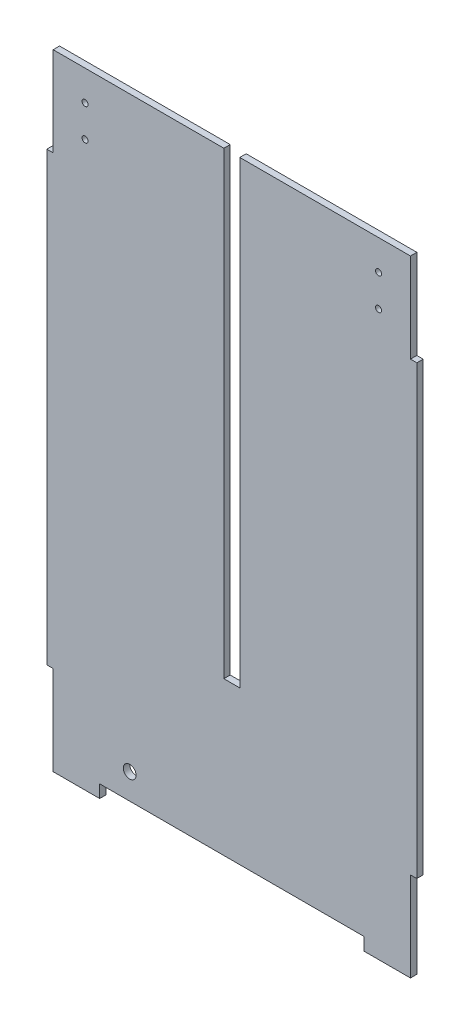
ISO-10303-21;
HEADER;
FILE_DESCRIPTION(('STEP AP214'),'2;1');
FILE_NAME('part.step','',(''),(''),'','','');
FILE_SCHEMA(('AUTOMOTIVE_DESIGN { 1 0 10303 214 1 1 1 1 }'));
ENDSEC;
DATA;
#1=APPLICATION_CONTEXT('core data for automotive mechanical design processes');
#2=APPLICATION_PROTOCOL_DEFINITION('international standard','automotive_design',2000,#1);
#3=PRODUCT_CONTEXT('',#1,'mechanical');
#4=PRODUCT('Part','Part','',(#3));
#5=PRODUCT_RELATED_PRODUCT_CATEGORY('part','',(#4));
#6=PRODUCT_DEFINITION_FORMATION('','',#4);
#7=PRODUCT_DEFINITION_CONTEXT('part definition',#1,'design');
#8=PRODUCT_DEFINITION('design','',#6,#7);
#9=PRODUCT_DEFINITION_SHAPE('','',#8);
#10=(LENGTH_UNIT() NAMED_UNIT(*) SI_UNIT(.MILLI.,.METRE.));
#11=(NAMED_UNIT(*) PLANE_ANGLE_UNIT() SI_UNIT($,.RADIAN.));
#12=(NAMED_UNIT(*) SI_UNIT($,.STERADIAN.) SOLID_ANGLE_UNIT());
#13=UNCERTAINTY_MEASURE_WITH_UNIT(LENGTH_MEASURE(1.E-05),#10,'distance_accuracy_value','');
#14=(GEOMETRIC_REPRESENTATION_CONTEXT(3) GLOBAL_UNCERTAINTY_ASSIGNED_CONTEXT((#13)) GLOBAL_UNIT_ASSIGNED_CONTEXT((#10,
#11,#12)) REPRESENTATION_CONTEXT('',''));
#15=CARTESIAN_POINT('',(0.,0.,0.));
#16=DIRECTION('',(0.,0.,1.));
#17=DIRECTION('',(1.,0.,0.));
#18=AXIS2_PLACEMENT_3D('',#15,#16,#17);
#19=CARTESIAN_POINT('',(0.,152.4,3.175));
#20=DIRECTION('',(0.,1.,0.));
#21=DIRECTION('',(0.,0.,1.));
#22=AXIS2_PLACEMENT_3D('',#19,#20,#21);
#23=PLANE('',#22);
#24=DIRECTION('',(0.,0.,1.));
#25=VECTOR('',#24,1.);
#26=CARTESIAN_POINT('',(-3.96875000000001,152.4,0.));
#27=LINE('',#26,#25);
#28=CARTESIAN_POINT('',(-3.96875000000001,152.4,0.));
#29=VERTEX_POINT('',#28);
#30=CARTESIAN_POINT('',(-3.96875000000001,152.4,3.175));
#31=VERTEX_POINT('',#30);
#32=EDGE_CURVE('E197',#29,#31,#27,.T.);
#33=ORIENTED_EDGE('',*,*,#32,.F.);
#34=DIRECTION('',(1.,0.,0.));
#35=VECTOR('',#34,1.);
#36=CARTESIAN_POINT('',(0.,152.4,0.));
#37=LINE('',#36,#35);
#38=CARTESIAN_POINT('',(-88.9,152.4,0.));
#39=VERTEX_POINT('',#38);
#40=EDGE_CURVE('E212',#39,#29,#37,.T.);
#41=ORIENTED_EDGE('',*,*,#40,.F.);
#42=DIRECTION('',(0.,0.,-1.));
#43=VECTOR('',#42,1.);
#44=CARTESIAN_POINT('',(-88.9,152.4,3.175));
#45=LINE('',#44,#43);
#46=CARTESIAN_POINT('',(-88.9,152.4,3.175));
#47=VERTEX_POINT('',#46);
#48=EDGE_CURVE('E243',#47,#39,#45,.T.);
#49=ORIENTED_EDGE('',*,*,#48,.F.);
#50=DIRECTION('',(1.,0.,0.));
#51=VECTOR('',#50,1.);
#52=CARTESIAN_POINT('',(0.,152.4,3.175));
#53=LINE('',#52,#51);
#54=EDGE_CURVE('E294',#47,#31,#53,.T.);
#55=ORIENTED_EDGE('',*,*,#54,.T.);
#56=EDGE_LOOP('',(#33,#41,#49,#55));
#57=FACE_BOUND('',#56,.T.);
#58=ADVANCED_FACE('F36',(#57),#23,.T.);
#59=CARTESIAN_POINT('',(65.7678571428565,2.87468461733298E-13,3.175));
#60=DIRECTION('',(1.,0.,0.));
#61=DIRECTION('',(0.,1.,0.));
#62=AXIS2_PLACEMENT_3D('',#59,#60,#61);
#63=PLANE('',#62);
#64=DIRECTION('',(0.,-1.,0.));
#65=VECTOR('',#64,1.);
#66=CARTESIAN_POINT('',(65.7678571428565,2.87468461733298E-13,0.));
#67=LINE('',#66,#65);
#68=CARTESIAN_POINT('',(65.7678571428572,-152.4,0.));
#69=VERTEX_POINT('',#68);
#70=CARTESIAN_POINT('',(65.7678571428572,-158.75,0.));
#71=VERTEX_POINT('',#70);
#72=EDGE_CURVE('E193',#69,#71,#67,.T.);
#73=ORIENTED_EDGE('',*,*,#72,.T.);
#74=DIRECTION('',(0.,0.,-1.));
#75=VECTOR('',#74,1.);
#76=CARTESIAN_POINT('',(65.7678571428572,-158.75,3.175));
#77=LINE('',#76,#75);
#78=CARTESIAN_POINT('',(65.7678571428572,-158.75,3.175));
#79=VERTEX_POINT('',#78);
#80=EDGE_CURVE('E44',#79,#71,#77,.T.);
#81=ORIENTED_EDGE('',*,*,#80,.F.);
#82=DIRECTION('',(0.,-1.,0.));
#83=VECTOR('',#82,1.);
#84=CARTESIAN_POINT('',(65.7678571428565,2.87468461733298E-13,3.175));
#85=LINE('',#84,#83);
#86=CARTESIAN_POINT('',(65.7678571428572,-152.4,3.175));
#87=VERTEX_POINT('',#86);
#88=EDGE_CURVE('E279',#87,#79,#85,.T.);
#89=ORIENTED_EDGE('',*,*,#88,.F.);
#90=DIRECTION('',(0.,0.,-1.));
#91=VECTOR('',#90,1.);
#92=CARTESIAN_POINT('',(65.7678571428572,-152.4,3.175));
#93=LINE('',#92,#91);
#94=EDGE_CURVE('E11',#87,#69,#93,.T.);
#95=ORIENTED_EDGE('',*,*,#94,.T.);
#96=EDGE_LOOP('',(#73,#81,#89,#95));
#97=FACE_BOUND('',#96,.T.);
#98=ADVANCED_FACE('F38',(#97),#63,.F.);
#99=CARTESIAN_POINT('',(0.,-158.75,3.175));
#100=DIRECTION('',(0.,-1.,0.));
#101=DIRECTION('',(0.,0.,-1.));
#102=AXIS2_PLACEMENT_3D('',#99,#100,#101);
#103=PLANE('',#102);
#104=DIRECTION('',(-1.,0.,0.));
#105=VECTOR('',#104,1.);
#106=CARTESIAN_POINT('',(0.,-158.75,0.));
#107=LINE('',#106,#105);
#108=CARTESIAN_POINT('',(88.9000000000028,-158.75,0.));
#109=VERTEX_POINT('',#108);
#110=EDGE_CURVE('E196',#109,#71,#107,.T.);
#111=ORIENTED_EDGE('',*,*,#110,.F.);
#112=DIRECTION('',(0.,0.,-1.));
#113=VECTOR('',#112,1.);
#114=CARTESIAN_POINT('',(88.9000000000028,-158.75,3.175));
#115=LINE('',#114,#113);
#116=CARTESIAN_POINT('',(88.9000000000028,-158.75,3.175));
#117=VERTEX_POINT('',#116);
#118=EDGE_CURVE('E257',#117,#109,#115,.T.);
#119=ORIENTED_EDGE('',*,*,#118,.F.);
#120=DIRECTION('',(-1.,0.,0.));
#121=VECTOR('',#120,1.);
#122=CARTESIAN_POINT('',(0.,-158.75,3.175));
#123=LINE('',#122,#121);
#124=EDGE_CURVE('E264',#117,#79,#123,.T.);
#125=ORIENTED_EDGE('',*,*,#124,.T.);
#126=ORIENTED_EDGE('',*,*,#80,.T.);
#127=EDGE_LOOP('',(#111,#119,#125,#126));
#128=FACE_BOUND('',#127,.T.);
#129=ADVANCED_FACE('F262',(#128),#103,.T.);
#130=CARTESIAN_POINT('',(88.9,0.,3.175));
#131=DIRECTION('',(1.,0.,0.));
#132=DIRECTION('',(0.,0.,-1.));
#133=AXIS2_PLACEMENT_3D('',#130,#131,#132);
#134=PLANE('',#133);
#135=DIRECTION('',(0.,-1.,0.));
#136=VECTOR('',#135,1.);
#137=CARTESIAN_POINT('',(88.9,0.,0.));
#138=LINE('',#137,#136);
#139=CARTESIAN_POINT('',(88.9,-114.3,0.));
#140=VERTEX_POINT('',#139);
#141=EDGE_CURVE('E200',#140,#109,#138,.T.);
#142=ORIENTED_EDGE('',*,*,#141,.F.);
#143=DIRECTION('',(0.,0.,-1.));
#144=VECTOR('',#143,1.);
#145=CARTESIAN_POINT('',(88.9,-114.3,3.175));
#146=LINE('',#145,#144);
#147=CARTESIAN_POINT('',(88.9,-114.3,3.175));
#148=VERTEX_POINT('',#147);
#149=EDGE_CURVE('E255',#148,#140,#146,.T.);
#150=ORIENTED_EDGE('',*,*,#149,.F.);
#151=DIRECTION('',(0.,-1.,0.));
#152=VECTOR('',#151,1.);
#153=CARTESIAN_POINT('',(88.9,0.,3.175));
#154=LINE('',#153,#152);
#155=EDGE_CURVE('E278',#148,#117,#154,.T.);
#156=ORIENTED_EDGE('',*,*,#155,.T.);
#157=ORIENTED_EDGE('',*,*,#118,.T.);
#158=EDGE_LOOP('',(#142,#150,#156,#157));
#159=FACE_BOUND('',#158,.T.);
#160=ADVANCED_FACE('F274',(#159),#134,.T.);
#161=CARTESIAN_POINT('',(0.,-114.3,3.175));
#162=DIRECTION('',(0.,1.,0.));
#163=DIRECTION('',(0.,0.,1.));
#164=AXIS2_PLACEMENT_3D('',#161,#162,#163);
#165=PLANE('',#164);
#166=DIRECTION('',(1.,0.,0.));
#167=VECTOR('',#166,1.);
#168=CARTESIAN_POINT('',(0.,-114.3,0.));
#169=LINE('',#168,#167);
#170=CARTESIAN_POINT('',(92.0750000000023,-114.3,0.));
#171=VERTEX_POINT('',#170);
#172=EDGE_CURVE('E203',#140,#171,#169,.T.);
#173=ORIENTED_EDGE('',*,*,#172,.T.);
#174=DIRECTION('',(0.,0.,-1.));
#175=VECTOR('',#174,1.);
#176=CARTESIAN_POINT('',(92.0750000000023,-114.3,3.175));
#177=LINE('',#176,#175);
#178=CARTESIAN_POINT('',(92.0750000000023,-114.3,3.175));
#179=VERTEX_POINT('',#178);
#180=EDGE_CURVE('E252',#179,#171,#177,.T.);
#181=ORIENTED_EDGE('',*,*,#180,.F.);
#182=DIRECTION('',(1.,0.,0.));
#183=VECTOR('',#182,1.);
#184=CARTESIAN_POINT('',(0.,-114.3,3.175));
#185=LINE('',#184,#183);
#186=EDGE_CURVE('E281',#148,#179,#185,.T.);
#187=ORIENTED_EDGE('',*,*,#186,.F.);
#188=ORIENTED_EDGE('',*,*,#149,.T.);
#189=EDGE_LOOP('',(#173,#181,#187,#188));
#190=FACE_BOUND('',#189,.T.);
#191=ADVANCED_FACE('F530',(#190),#165,.F.);
#192=CARTESIAN_POINT('',(92.0750000000005,0.,3.175));
#193=DIRECTION('',(1.,0.,0.));
#194=DIRECTION('',(0.,0.,-1.));
#195=AXIS2_PLACEMENT_3D('',#192,#193,#194);
#196=PLANE('',#195);
#197=DIRECTION('',(0.,-1.,0.));
#198=VECTOR('',#197,1.);
#199=CARTESIAN_POINT('',(92.0750000000005,0.,0.));
#200=LINE('',#199,#198);
#201=CARTESIAN_POINT('',(92.075,107.95,0.));
#202=VERTEX_POINT('',#201);
#203=EDGE_CURVE('E207',#202,#171,#200,.T.);
#204=ORIENTED_EDGE('',*,*,#203,.F.);
#205=DIRECTION('',(0.,0.,-1.));
#206=VECTOR('',#205,1.);
#207=CARTESIAN_POINT('',(92.075,107.95,3.175));
#208=LINE('',#207,#206);
#209=CARTESIAN_POINT('',(92.075,107.95,3.175));
#210=VERTEX_POINT('',#209);
#211=EDGE_CURVE('E250',#210,#202,#208,.T.);
#212=ORIENTED_EDGE('',*,*,#211,.F.);
#213=DIRECTION('',(0.,-1.,0.));
#214=VECTOR('',#213,1.);
#215=CARTESIAN_POINT('',(92.0750000000023,0.,3.175));
#216=LINE('',#215,#214);
#217=EDGE_CURVE('E288',#210,#179,#216,.T.);
#218=ORIENTED_EDGE('',*,*,#217,.T.);
#219=ORIENTED_EDGE('',*,*,#180,.T.);
#220=EDGE_LOOP('',(#204,#212,#218,#219));
#221=FACE_BOUND('',#220,.T.);
#222=ADVANCED_FACE('F526',(#221),#196,.T.);
#223=CARTESIAN_POINT('',(0.,107.95,3.175));
#224=DIRECTION('',(0.,1.,0.));
#225=DIRECTION('',(0.,0.,1.));
#226=AXIS2_PLACEMENT_3D('',#223,#224,#225);
#227=PLANE('',#226);
#228=DIRECTION('',(1.,0.,0.));
#229=VECTOR('',#228,1.);
#230=CARTESIAN_POINT('',(0.,107.95,0.));
#231=LINE('',#230,#229);
#232=CARTESIAN_POINT('',(88.9,107.95,0.));
#233=VERTEX_POINT('',#232);
#234=EDGE_CURVE('E209',#233,#202,#231,.T.);
#235=ORIENTED_EDGE('',*,*,#234,.F.);
#236=DIRECTION('',(0.,0.,-1.));
#237=VECTOR('',#236,1.);
#238=CARTESIAN_POINT('',(88.9,107.95,3.175));
#239=LINE('',#238,#237);
#240=CARTESIAN_POINT('',(88.9,107.95,3.175));
#241=VERTEX_POINT('',#240);
#242=EDGE_CURVE('E248',#241,#233,#239,.T.);
#243=ORIENTED_EDGE('',*,*,#242,.F.);
#244=DIRECTION('',(1.,0.,0.));
#245=VECTOR('',#244,1.);
#246=CARTESIAN_POINT('',(0.,107.95,3.175));
#247=LINE('',#246,#245);
#248=EDGE_CURVE('E291',#241,#210,#247,.T.);
#249=ORIENTED_EDGE('',*,*,#248,.T.);
#250=ORIENTED_EDGE('',*,*,#211,.T.);
#251=EDGE_LOOP('',(#235,#243,#249,#250));
#252=FACE_BOUND('',#251,.T.);
#253=ADVANCED_FACE('F340',(#252),#227,.T.);
#254=CARTESIAN_POINT('',(88.9,152.4,0.));
#255=VERTEX_POINT('',#254);
#256=EDGE_CURVE('E204',#255,#233,#138,.T.);
#257=ORIENTED_EDGE('',*,*,#256,.F.);
#258=DIRECTION('',(0.,0.,-1.));
#259=VECTOR('',#258,1.);
#260=CARTESIAN_POINT('',(88.9,152.4,3.175));
#261=LINE('',#260,#259);
#262=CARTESIAN_POINT('',(88.9,152.4,3.175));
#263=VERTEX_POINT('',#262);
#264=EDGE_CURVE('E245',#263,#255,#261,.T.);
#265=ORIENTED_EDGE('',*,*,#264,.F.);
#266=EDGE_CURVE('E283',#263,#241,#154,.T.);
#267=ORIENTED_EDGE('',*,*,#266,.T.);
#268=ORIENTED_EDGE('',*,*,#242,.T.);
#269=EDGE_LOOP('',(#257,#265,#267,#268));
#270=FACE_BOUND('',#269,.T.);
#271=ADVANCED_FACE('F331',(#270),#134,.T.);
#272=DIRECTION('',(0.,0.,1.));
#273=VECTOR('',#272,1.);
#274=CARTESIAN_POINT('',(3.96874999999998,152.4,0.));
#275=LINE('',#274,#273);
#276=CARTESIAN_POINT('',(3.96874999999998,152.4,0.));
#277=VERTEX_POINT('',#276);
#278=CARTESIAN_POINT('',(3.96874999999998,152.4,3.175));
#279=VERTEX_POINT('',#278);
#280=EDGE_CURVE('E345',#277,#279,#275,.T.);
#281=ORIENTED_EDGE('',*,*,#280,.T.);
#282=EDGE_CURVE('E298',#279,#263,#53,.T.);
#283=ORIENTED_EDGE('',*,*,#282,.T.);
#284=ORIENTED_EDGE('',*,*,#264,.T.);
#285=EDGE_CURVE('E216',#277,#255,#37,.T.);
#286=ORIENTED_EDGE('',*,*,#285,.F.);
#287=EDGE_LOOP('',(#281,#283,#284,#286));
#288=FACE_BOUND('',#287,.T.);
#289=ADVANCED_FACE('F322',(#288),#23,.T.);
#290=CARTESIAN_POINT('',(-88.9,0.,3.175));
#291=DIRECTION('',(1.,0.,0.));
#292=DIRECTION('',(0.,0.,-1.));
#293=AXIS2_PLACEMENT_3D('',#290,#291,#292);
#294=PLANE('',#293);
#295=DIRECTION('',(0.,-1.,0.));
#296=VECTOR('',#295,1.);
#297=CARTESIAN_POINT('',(-88.9,0.,0.));
#298=LINE('',#297,#296);
#299=CARTESIAN_POINT('',(-88.9,107.95,0.));
#300=VERTEX_POINT('',#299);
#301=EDGE_CURVE('E215',#39,#300,#298,.T.);
#302=ORIENTED_EDGE('',*,*,#301,.T.);
#303=DIRECTION('',(0.,0.,-1.));
#304=VECTOR('',#303,1.);
#305=CARTESIAN_POINT('',(-88.9,107.95,3.175));
#306=LINE('',#305,#304);
#307=CARTESIAN_POINT('',(-88.9,107.95,3.175));
#308=VERTEX_POINT('',#307);
#309=EDGE_CURVE('E240',#308,#300,#306,.T.);
#310=ORIENTED_EDGE('',*,*,#309,.F.);
#311=DIRECTION('',(0.,-1.,0.));
#312=VECTOR('',#311,1.);
#313=CARTESIAN_POINT('',(-88.9,0.,3.175));
#314=LINE('',#313,#312);
#315=EDGE_CURVE('E297',#47,#308,#314,.T.);
#316=ORIENTED_EDGE('',*,*,#315,.F.);
#317=ORIENTED_EDGE('',*,*,#48,.T.);
#318=EDGE_LOOP('',(#302,#310,#316,#317));
#319=FACE_BOUND('',#318,.T.);
#320=ADVANCED_FACE('F330',(#319),#294,.F.);
#321=CARTESIAN_POINT('',(0.,107.95,3.175));
#322=DIRECTION('',(0.,-1.,0.));
#323=DIRECTION('',(0.,0.,-1.));
#324=AXIS2_PLACEMENT_3D('',#321,#322,#323);
#325=PLANE('',#324);
#326=DIRECTION('',(-1.,0.,0.));
#327=VECTOR('',#326,1.);
#328=CARTESIAN_POINT('',(0.,107.95,0.));
#329=LINE('',#328,#327);
#330=CARTESIAN_POINT('',(-92.075,107.95,0.));
#331=VERTEX_POINT('',#330);
#332=EDGE_CURVE('E218',#300,#331,#329,.T.);
#333=ORIENTED_EDGE('',*,*,#332,.T.);
#334=DIRECTION('',(0.,0.,-1.));
#335=VECTOR('',#334,1.);
#336=CARTESIAN_POINT('',(-92.075,107.95,3.175));
#337=LINE('',#336,#335);
#338=CARTESIAN_POINT('',(-92.075,107.95,3.175));
#339=VERTEX_POINT('',#338);
#340=EDGE_CURVE('E237',#339,#331,#337,.T.);
#341=ORIENTED_EDGE('',*,*,#340,.F.);
#342=DIRECTION('',(-1.,0.,0.));
#343=VECTOR('',#342,1.);
#344=CARTESIAN_POINT('',(0.,107.95,3.175));
#345=LINE('',#344,#343);
#346=EDGE_CURVE('E300',#308,#339,#345,.T.);
#347=ORIENTED_EDGE('',*,*,#346,.F.);
#348=ORIENTED_EDGE('',*,*,#309,.T.);
#349=EDGE_LOOP('',(#333,#341,#347,#348));
#350=FACE_BOUND('',#349,.T.);
#351=ADVANCED_FACE('F337',(#350),#325,.F.);
#352=CARTESIAN_POINT('',(-92.0749999999977,0.,3.175));
#353=DIRECTION('',(1.,0.,0.));
#354=DIRECTION('',(0.,0.,-1.));
#355=AXIS2_PLACEMENT_3D('',#352,#353,#354);
#356=PLANE('',#355);
#357=DIRECTION('',(0.,-1.,0.));
#358=VECTOR('',#357,1.);
#359=CARTESIAN_POINT('',(-92.0749999999977,0.,0.));
#360=LINE('',#359,#358);
#361=CARTESIAN_POINT('',(-92.0749999999977,-114.3,0.));
#362=VERTEX_POINT('',#361);
#363=EDGE_CURVE('E221',#331,#362,#360,.T.);
#364=ORIENTED_EDGE('',*,*,#363,.T.);
#365=DIRECTION('',(0.,0.,-1.));
#366=VECTOR('',#365,1.);
#367=CARTESIAN_POINT('',(-92.0749999999977,-114.3,3.175));
#368=LINE('',#367,#366);
#369=CARTESIAN_POINT('',(-92.0749999999977,-114.3,3.175));
#370=VERTEX_POINT('',#369);
#371=EDGE_CURVE('E235',#370,#362,#368,.T.);
#372=ORIENTED_EDGE('',*,*,#371,.F.);
#373=DIRECTION('',(0.,-1.,0.));
#374=VECTOR('',#373,1.);
#375=CARTESIAN_POINT('',(-92.0749999999989,-9.48645923719877E-13,3.175));
#376=LINE('',#375,#374);
#377=EDGE_CURVE('E302',#339,#370,#376,.T.);
#378=ORIENTED_EDGE('',*,*,#377,.F.);
#379=ORIENTED_EDGE('',*,*,#340,.T.);
#380=EDGE_LOOP('',(#364,#372,#378,#379));
#381=FACE_BOUND('',#380,.T.);
#382=ADVANCED_FACE('F410',(#381),#356,.F.);
#383=CARTESIAN_POINT('',(0.,-114.3,3.175));
#384=DIRECTION('',(0.,-1.,0.));
#385=DIRECTION('',(0.,0.,-1.));
#386=AXIS2_PLACEMENT_3D('',#383,#384,#385);
#387=PLANE('',#386);
#388=DIRECTION('',(-1.,0.,0.));
#389=VECTOR('',#388,1.);
#390=CARTESIAN_POINT('',(0.,-114.3,0.));
#391=LINE('',#390,#389);
#392=CARTESIAN_POINT('',(-88.9,-114.3,0.));
#393=VERTEX_POINT('',#392);
#394=EDGE_CURVE('E224',#393,#362,#391,.T.);
#395=ORIENTED_EDGE('',*,*,#394,.F.);
#396=DIRECTION('',(0.,0.,-1.));
#397=VECTOR('',#396,1.);
#398=CARTESIAN_POINT('',(-88.9,-114.3,3.175));
#399=LINE('',#398,#397);
#400=CARTESIAN_POINT('',(-88.9,-114.3,3.175));
#401=VERTEX_POINT('',#400);
#402=EDGE_CURVE('E181',#401,#393,#399,.T.);
#403=ORIENTED_EDGE('',*,*,#402,.F.);
#404=DIRECTION('',(-1.,0.,0.));
#405=VECTOR('',#404,1.);
#406=CARTESIAN_POINT('',(0.,-114.3,3.175));
#407=LINE('',#406,#405);
#408=EDGE_CURVE('E170',#401,#370,#407,.T.);
#409=ORIENTED_EDGE('',*,*,#408,.T.);
#410=ORIENTED_EDGE('',*,*,#371,.T.);
#411=EDGE_LOOP('',(#395,#403,#409,#410));
#412=FACE_BOUND('',#411,.T.);
#413=ADVANCED_FACE('F305',(#412),#387,.T.);
#414=CARTESIAN_POINT('',(-88.8999999999972,0.,3.175));
#415=DIRECTION('',(1.,0.,0.));
#416=DIRECTION('',(0.,0.,-1.));
#417=AXIS2_PLACEMENT_3D('',#414,#415,#416);
#418=PLANE('',#417);
#419=DIRECTION('',(0.,-1.,0.));
#420=VECTOR('',#419,1.);
#421=CARTESIAN_POINT('',(-88.8999999999972,0.,0.));
#422=LINE('',#421,#420);
#423=CARTESIAN_POINT('',(-88.8999999999972,-158.75,0.));
#424=VERTEX_POINT('',#423);
#425=EDGE_CURVE('E177',#393,#424,#422,.T.);
#426=ORIENTED_EDGE('',*,*,#425,.T.);
#427=DIRECTION('',(0.,0.,-1.));
#428=VECTOR('',#427,1.);
#429=CARTESIAN_POINT('',(-88.8999999999972,-158.75,3.175));
#430=LINE('',#429,#428);
#431=CARTESIAN_POINT('',(-88.8999999999972,-158.75,3.175));
#432=VERTEX_POINT('',#431);
#433=EDGE_CURVE('E174',#432,#424,#430,.T.);
#434=ORIENTED_EDGE('',*,*,#433,.F.);
#435=DIRECTION('',(0.,-1.,0.));
#436=VECTOR('',#435,1.);
#437=CARTESIAN_POINT('',(-88.8999999999972,0.,3.175));
#438=LINE('',#437,#436);
#439=EDGE_CURVE('E162',#401,#432,#438,.T.);
#440=ORIENTED_EDGE('',*,*,#439,.F.);
#441=ORIENTED_EDGE('',*,*,#402,.T.);
#442=EDGE_LOOP('',(#426,#434,#440,#441));
#443=FACE_BOUND('',#442,.T.);
#444=ADVANCED_FACE('F175',(#443),#418,.F.);
#445=CARTESIAN_POINT('',(0.,-158.75,3.175));
#446=DIRECTION('',(0.,-1.,0.));
#447=DIRECTION('',(0.,0.,-1.));
#448=AXIS2_PLACEMENT_3D('',#445,#446,#447);
#449=PLANE('',#448);
#450=DIRECTION('',(-1.,0.,0.));
#451=VECTOR('',#450,1.);
#452=CARTESIAN_POINT('',(0.,-158.75,0.));
#453=LINE('',#452,#451);
#454=CARTESIAN_POINT('',(-65.7678571428571,-158.75,0.));
#455=VERTEX_POINT('',#454);
#456=EDGE_CURVE('E228',#455,#424,#453,.T.);
#457=ORIENTED_EDGE('',*,*,#456,.F.);
#458=DIRECTION('',(0.,0.,-1.));
#459=VECTOR('',#458,1.);
#460=CARTESIAN_POINT('',(-65.7678571428571,-158.75,3.175));
#461=LINE('',#460,#459);
#462=CARTESIAN_POINT('',(-65.7678571428571,-158.75,3.175));
#463=VERTEX_POINT('',#462);
#464=EDGE_CURVE('E182',#463,#455,#461,.T.);
#465=ORIENTED_EDGE('',*,*,#464,.F.);
#466=DIRECTION('',(-1.,0.,0.));
#467=VECTOR('',#466,1.);
#468=CARTESIAN_POINT('',(0.,-158.75,3.175));
#469=LINE('',#468,#467);
#470=EDGE_CURVE('E167',#463,#432,#469,.T.);
#471=ORIENTED_EDGE('',*,*,#470,.T.);
#472=ORIENTED_EDGE('',*,*,#433,.T.);
#473=EDGE_LOOP('',(#457,#465,#471,#472));
#474=FACE_BOUND('',#473,.T.);
#475=ADVANCED_FACE('F184',(#474),#449,.T.);
#476=CARTESIAN_POINT('',(-65.7678571428578,-2.87468461733304E-13,3.175));
#477=DIRECTION('',(1.,0.,0.));
#478=DIRECTION('',(0.,1.,0.));
#479=AXIS2_PLACEMENT_3D('',#476,#477,#478);
#480=PLANE('',#479);
#481=DIRECTION('',(0.,-1.,0.));
#482=VECTOR('',#481,1.);
#483=CARTESIAN_POINT('',(-65.7678571428578,-2.87468461733304E-13,0.));
#484=LINE('',#483,#482);
#485=CARTESIAN_POINT('',(-65.7678571428571,-152.4,0.));
#486=VERTEX_POINT('',#485);
#487=EDGE_CURVE('E192',#486,#455,#484,.T.);
#488=ORIENTED_EDGE('',*,*,#487,.F.);
#489=DIRECTION('',(0.,0.,-1.));
#490=VECTOR('',#489,1.);
#491=CARTESIAN_POINT('',(-65.7678571428571,-152.4,3.175));
#492=LINE('',#491,#490);
#493=CARTESIAN_POINT('',(-65.7678571428571,-152.4,3.175));
#494=VERTEX_POINT('',#493);
#495=EDGE_CURVE('E114',#494,#486,#492,.T.);
#496=ORIENTED_EDGE('',*,*,#495,.F.);
#497=DIRECTION('',(0.,-1.,0.));
#498=VECTOR('',#497,1.);
#499=CARTESIAN_POINT('',(-65.7678571428578,-2.87468461733304E-13,3.175));
#500=LINE('',#499,#498);
#501=EDGE_CURVE('E185',#494,#463,#500,.T.);
#502=ORIENTED_EDGE('',*,*,#501,.T.);
#503=ORIENTED_EDGE('',*,*,#464,.T.);
#504=EDGE_LOOP('',(#488,#496,#502,#503));
#505=FACE_BOUND('',#504,.T.);
#506=ADVANCED_FACE('F309',(#505),#480,.T.);
#507=CARTESIAN_POINT('',(0.,-152.4,3.175));
#508=DIRECTION('',(0.,1.,0.));
#509=DIRECTION('',(0.,0.,1.));
#510=AXIS2_PLACEMENT_3D('',#507,#508,#509);
#511=PLANE('',#510);
#512=DIRECTION('',(1.,0.,0.));
#513=VECTOR('',#512,1.);
#514=CARTESIAN_POINT('',(0.,-152.4,0.));
#515=LINE('',#514,#513);
#516=EDGE_CURVE('E190',#486,#69,#515,.T.);
#517=ORIENTED_EDGE('',*,*,#516,.T.);
#518=ORIENTED_EDGE('',*,*,#94,.F.);
#519=DIRECTION('',(1.,0.,0.));
#520=VECTOR('',#519,1.);
#521=CARTESIAN_POINT('',(0.,-152.4,3.175));
#522=LINE('',#521,#520);
#523=EDGE_CURVE('E60',#494,#87,#522,.T.);
#524=ORIENTED_EDGE('',*,*,#523,.F.);
#525=ORIENTED_EDGE('',*,*,#495,.T.);
#526=EDGE_LOOP('',(#517,#518,#524,#525));
#527=FACE_BOUND('',#526,.T.);
#528=ADVANCED_FACE('F311',(#527),#511,.F.);
#529=CARTESIAN_POINT('',(0.,0.,3.175));
#530=DIRECTION('',(0.,0.,1.));
#531=DIRECTION('',(1.,0.,0.));
#532=AXIS2_PLACEMENT_3D('',#529,#530,#531);
#533=PLANE('',#532);
#534=ORIENTED_EDGE('',*,*,#501,.F.);
#535=ORIENTED_EDGE('',*,*,#523,.T.);
#536=ORIENTED_EDGE('',*,*,#88,.T.);
#537=ORIENTED_EDGE('',*,*,#124,.F.);
#538=ORIENTED_EDGE('',*,*,#155,.F.);
#539=ORIENTED_EDGE('',*,*,#186,.T.);
#540=ORIENTED_EDGE('',*,*,#217,.F.);
#541=ORIENTED_EDGE('',*,*,#248,.F.);
#542=ORIENTED_EDGE('',*,*,#266,.F.);
#543=ORIENTED_EDGE('',*,*,#282,.F.);
#544=DIRECTION('',(0.,1.,0.));
#545=VECTOR('',#544,1.);
#546=CARTESIAN_POINT('',(3.96874999999998,152.4,3.175));
#547=LINE('',#546,#545);
#548=CARTESIAN_POINT('',(3.96875000000001,-76.2,3.175));
#549=VERTEX_POINT('',#548);
#550=EDGE_CURVE('E356',#549,#279,#547,.T.);
#551=ORIENTED_EDGE('',*,*,#550,.F.);
#552=DIRECTION('',(1.,0.,0.));
#553=VECTOR('',#552,1.);
#554=CARTESIAN_POINT('',(-3.96874999999999,-76.2,3.175));
#555=LINE('',#554,#553);
#556=CARTESIAN_POINT('',(-3.96874999999999,-76.2,3.175));
#557=VERTEX_POINT('',#556);
#558=EDGE_CURVE('E379',#557,#549,#555,.T.);
#559=ORIENTED_EDGE('',*,*,#558,.F.);
#560=DIRECTION('',(0.,-1.,0.));
#561=VECTOR('',#560,1.);
#562=CARTESIAN_POINT('',(-3.96875000000001,152.4,3.175));
#563=LINE('',#562,#561);
#564=EDGE_CURVE('E376',#31,#557,#563,.T.);
#565=ORIENTED_EDGE('',*,*,#564,.F.);
#566=ORIENTED_EDGE('',*,*,#54,.F.);
#567=ORIENTED_EDGE('',*,*,#315,.T.);
#568=ORIENTED_EDGE('',*,*,#346,.T.);
#569=ORIENTED_EDGE('',*,*,#377,.T.);
#570=ORIENTED_EDGE('',*,*,#408,.F.);
#571=ORIENTED_EDGE('',*,*,#439,.T.);
#572=ORIENTED_EDGE('',*,*,#470,.F.);
#573=EDGE_LOOP('',(#534,#535,#536,#537,#538,#539,#540,#541,#542,#543,#551,#559,#565,#566,#567,
#568,#569,#570,#571,#572));
#574=FACE_BOUND('',#573,.T.);
#575=CARTESIAN_POINT('',(73.025,137.4,3.175));
#576=DIRECTION('',(0.,0.,1.));
#577=DIRECTION('',(-1.,0.,0.));
#578=AXIS2_PLACEMENT_3D('',#575,#576,#577);
#579=CIRCLE('',#578,1.50000000000001);
#580=CARTESIAN_POINT('',(71.525,137.4,3.175));
#581=VERTEX_POINT('',#580);
#582=EDGE_CURVE('E899',#581,#581,#579,.T.);
#583=ORIENTED_EDGE('',*,*,#582,.F.);
#584=EDGE_LOOP('',(#583));
#585=FACE_BOUND('',#584,.T.);
#586=CARTESIAN_POINT('',(73.025,121.65,3.175));
#587=DIRECTION('',(0.,0.,1.));
#588=DIRECTION('',(-1.,0.,0.));
#589=AXIS2_PLACEMENT_3D('',#586,#587,#588);
#590=CIRCLE('',#589,1.5);
#591=CARTESIAN_POINT('',(71.525,121.65,3.175));
#592=VERTEX_POINT('',#591);
#593=EDGE_CURVE('E901',#592,#592,#590,.T.);
#594=ORIENTED_EDGE('',*,*,#593,.F.);
#595=EDGE_LOOP('',(#594));
#596=FACE_BOUND('',#595,.T.);
#597=CARTESIAN_POINT('',(-73.025,121.65,3.175));
#598=DIRECTION('',(0.,0.,1.));
#599=DIRECTION('',(1.,0.,0.));
#600=AXIS2_PLACEMENT_3D('',#597,#598,#599);
#601=CIRCLE('',#600,1.5);
#602=CARTESIAN_POINT('',(-71.525,121.65,3.175));
#603=VERTEX_POINT('',#602);
#604=EDGE_CURVE('E929',#603,#603,#601,.T.);
#605=ORIENTED_EDGE('',*,*,#604,.F.);
#606=EDGE_LOOP('',(#605));
#607=FACE_BOUND('',#606,.T.);
#608=CARTESIAN_POINT('',(-73.025,137.4,3.175));
#609=DIRECTION('',(0.,0.,1.));
#610=DIRECTION('',(1.,0.,0.));
#611=AXIS2_PLACEMENT_3D('',#608,#609,#610);
#612=CIRCLE('',#611,1.50000000000001);
#613=CARTESIAN_POINT('',(-71.525,137.4,3.175));
#614=VERTEX_POINT('',#613);
#615=EDGE_CURVE('E907',#614,#614,#612,.T.);
#616=ORIENTED_EDGE('',*,*,#615,.F.);
#617=EDGE_LOOP('',(#616));
#618=FACE_BOUND('',#617,.T.);
#619=CARTESIAN_POINT('',(-50.8,-139.7,3.175));
#620=DIRECTION('',(0.,0.,1.));
#621=DIRECTION('',(1.,0.,0.));
#622=AXIS2_PLACEMENT_3D('',#619,#620,#621);
#623=CIRCLE('',#622,3.175);
#624=CARTESIAN_POINT('',(-47.625,-139.7,3.175));
#625=VERTEX_POINT('',#624);
#626=EDGE_CURVE('E914',#625,#625,#623,.T.);
#627=ORIENTED_EDGE('',*,*,#626,.F.);
#628=EDGE_LOOP('',(#627));
#629=FACE_BOUND('',#628,.T.);
#630=ADVANCED_FACE('F164',(#574,#585,#596,#607,#618,#629),#533,.T.);
#631=CARTESIAN_POINT('',(0.,0.,0.));
#632=DIRECTION('',(0.,0.,1.));
#633=DIRECTION('',(1.,0.,0.));
#634=AXIS2_PLACEMENT_3D('',#631,#632,#633);
#635=PLANE('',#634);
#636=ORIENTED_EDGE('',*,*,#72,.F.);
#637=ORIENTED_EDGE('',*,*,#516,.F.);
#638=ORIENTED_EDGE('',*,*,#487,.T.);
#639=ORIENTED_EDGE('',*,*,#456,.T.);
#640=ORIENTED_EDGE('',*,*,#425,.F.);
#641=ORIENTED_EDGE('',*,*,#394,.T.);
#642=ORIENTED_EDGE('',*,*,#363,.F.);
#643=ORIENTED_EDGE('',*,*,#332,.F.);
#644=ORIENTED_EDGE('',*,*,#301,.F.);
#645=ORIENTED_EDGE('',*,*,#40,.T.);
#646=DIRECTION('',(0.,-1.,0.));
#647=VECTOR('',#646,1.);
#648=CARTESIAN_POINT('',(-3.96875000000001,152.4,0.));
#649=LINE('',#648,#647);
#650=CARTESIAN_POINT('',(-3.96874999999999,-76.2,0.));
#651=VERTEX_POINT('',#650);
#652=EDGE_CURVE('E372',#29,#651,#649,.T.);
#653=ORIENTED_EDGE('',*,*,#652,.T.);
#654=DIRECTION('',(1.,0.,0.));
#655=VECTOR('',#654,1.);
#656=CARTESIAN_POINT('',(-3.96874999999999,-76.2,0.));
#657=LINE('',#656,#655);
#658=CARTESIAN_POINT('',(3.96875000000001,-76.2,0.));
#659=VERTEX_POINT('',#658);
#660=EDGE_CURVE('E365',#651,#659,#657,.T.);
#661=ORIENTED_EDGE('',*,*,#660,.T.);
#662=DIRECTION('',(0.,1.,0.));
#663=VECTOR('',#662,1.);
#664=CARTESIAN_POINT('',(3.96874999999998,152.4,0.));
#665=LINE('',#664,#663);
#666=EDGE_CURVE('E51',#659,#277,#665,.T.);
#667=ORIENTED_EDGE('',*,*,#666,.T.);
#668=ORIENTED_EDGE('',*,*,#285,.T.);
#669=ORIENTED_EDGE('',*,*,#256,.T.);
#670=ORIENTED_EDGE('',*,*,#234,.T.);
#671=ORIENTED_EDGE('',*,*,#203,.T.);
#672=ORIENTED_EDGE('',*,*,#172,.F.);
#673=ORIENTED_EDGE('',*,*,#141,.T.);
#674=ORIENTED_EDGE('',*,*,#110,.T.);
#675=EDGE_LOOP('',(#636,#637,#638,#639,#640,#641,#642,#643,#644,#645,#653,#661,#667,#668,#669,
#670,#671,#672,#673,#674));
#676=FACE_BOUND('',#675,.T.);
#677=CARTESIAN_POINT('',(73.025,137.4,0.));
#678=DIRECTION('',(0.,0.,1.));
#679=DIRECTION('',(1.,0.,0.));
#680=AXIS2_PLACEMENT_3D('',#677,#678,#679);
#681=CIRCLE('',#680,1.50000000000001);
#682=CARTESIAN_POINT('',(74.525,137.4,0.));
#683=VERTEX_POINT('',#682);
#684=EDGE_CURVE('E896',#683,#683,#681,.F.);
#685=ORIENTED_EDGE('',*,*,#684,.F.);
#686=EDGE_LOOP('',(#685));
#687=FACE_BOUND('',#686,.T.);
#688=CARTESIAN_POINT('',(73.025,121.65,0.));
#689=DIRECTION('',(0.,0.,1.));
#690=DIRECTION('',(1.,0.,0.));
#691=AXIS2_PLACEMENT_3D('',#688,#689,#690);
#692=CIRCLE('',#691,1.5);
#693=CARTESIAN_POINT('',(74.525,121.65,0.));
#694=VERTEX_POINT('',#693);
#695=EDGE_CURVE('E904',#694,#694,#692,.F.);
#696=ORIENTED_EDGE('',*,*,#695,.F.);
#697=EDGE_LOOP('',(#696));
#698=FACE_BOUND('',#697,.T.);
#699=CARTESIAN_POINT('',(-73.025,121.65,0.));
#700=DIRECTION('',(0.,0.,1.));
#701=DIRECTION('',(1.,0.,0.));
#702=AXIS2_PLACEMENT_3D('',#699,#700,#701);
#703=CIRCLE('',#702,1.5);
#704=CARTESIAN_POINT('',(-71.525,121.65,0.));
#705=VERTEX_POINT('',#704);
#706=EDGE_CURVE('E911',#705,#705,#703,.F.);
#707=ORIENTED_EDGE('',*,*,#706,.F.);
#708=EDGE_LOOP('',(#707));
#709=FACE_BOUND('',#708,.T.);
#710=CARTESIAN_POINT('',(-73.025,137.4,0.));
#711=DIRECTION('',(0.,0.,1.));
#712=DIRECTION('',(1.,0.,0.));
#713=AXIS2_PLACEMENT_3D('',#710,#711,#712);
#714=CIRCLE('',#713,1.50000000000001);
#715=CARTESIAN_POINT('',(-71.525,137.4,0.));
#716=VERTEX_POINT('',#715);
#717=EDGE_CURVE('E910',#716,#716,#714,.F.);
#718=ORIENTED_EDGE('',*,*,#717,.F.);
#719=EDGE_LOOP('',(#718));
#720=FACE_BOUND('',#719,.T.);
#721=CARTESIAN_POINT('',(-50.8,-139.7,0.));
#722=DIRECTION('',(0.,0.,1.));
#723=DIRECTION('',(1.,0.,0.));
#724=AXIS2_PLACEMENT_3D('',#721,#722,#723);
#725=CIRCLE('',#724,3.175);
#726=CARTESIAN_POINT('',(-47.625,-139.7,0.));
#727=VERTEX_POINT('',#726);
#728=EDGE_CURVE('E380',#727,#727,#725,.T.);
#729=ORIENTED_EDGE('',*,*,#728,.T.);
#730=EDGE_LOOP('',(#729));
#731=FACE_BOUND('',#730,.T.);
#732=ADVANCED_FACE('F269',(#676,#687,#698,#709,#720,#731),#635,.F.);
#733=CARTESIAN_POINT('',(-3.96875000000001,152.4,0.));
#734=DIRECTION('',(-1.,0.,0.));
#735=DIRECTION('',(0.,-1.,0.));
#736=AXIS2_PLACEMENT_3D('',#733,#734,#735);
#737=PLANE('',#736);
#738=ORIENTED_EDGE('',*,*,#564,.T.);
#739=DIRECTION('',(0.,0.,1.));
#740=VECTOR('',#739,1.);
#741=CARTESIAN_POINT('',(-3.96874999999999,-76.2,0.));
#742=LINE('',#741,#740);
#743=EDGE_CURVE('E368',#651,#557,#742,.T.);
#744=ORIENTED_EDGE('',*,*,#743,.F.);
#745=ORIENTED_EDGE('',*,*,#652,.F.);
#746=ORIENTED_EDGE('',*,*,#32,.T.);
#747=EDGE_LOOP('',(#738,#744,#745,#746));
#748=FACE_BOUND('',#747,.T.);
#749=ADVANCED_FACE('F399',(#748),#737,.F.);
#750=CARTESIAN_POINT('',(3.96874999999998,152.4,0.));
#751=DIRECTION('',(1.,0.,0.));
#752=DIRECTION('',(0.,1.,0.));
#753=AXIS2_PLACEMENT_3D('',#750,#751,#752);
#754=PLANE('',#753);
#755=ORIENTED_EDGE('',*,*,#550,.T.);
#756=ORIENTED_EDGE('',*,*,#280,.F.);
#757=ORIENTED_EDGE('',*,*,#666,.F.);
#758=DIRECTION('',(0.,0.,1.));
#759=VECTOR('',#758,1.);
#760=CARTESIAN_POINT('',(3.96875000000001,-76.2,0.));
#761=LINE('',#760,#759);
#762=EDGE_CURVE('E351',#659,#549,#761,.T.);
#763=ORIENTED_EDGE('',*,*,#762,.T.);
#764=EDGE_LOOP('',(#755,#756,#757,#763));
#765=FACE_BOUND('',#764,.T.);
#766=ADVANCED_FACE('F386',(#765),#754,.F.);
#767=CARTESIAN_POINT('',(-3.96874999999999,-76.2,0.));
#768=DIRECTION('',(0.,-1.,0.));
#769=DIRECTION('',(0.,0.,-1.));
#770=AXIS2_PLACEMENT_3D('',#767,#768,#769);
#771=PLANE('',#770);
#772=ORIENTED_EDGE('',*,*,#558,.T.);
#773=ORIENTED_EDGE('',*,*,#762,.F.);
#774=ORIENTED_EDGE('',*,*,#660,.F.);
#775=ORIENTED_EDGE('',*,*,#743,.T.);
#776=EDGE_LOOP('',(#772,#773,#774,#775));
#777=FACE_BOUND('',#776,.T.);
#778=ADVANCED_FACE('F390',(#777),#771,.F.);
#779=CARTESIAN_POINT('',(-50.8,-139.7,0.));
#780=DIRECTION('',(0.,0.,1.));
#781=DIRECTION('',(1.,0.,0.));
#782=AXIS2_PLACEMENT_3D('',#779,#780,#781);
#783=CYLINDRICAL_SURFACE('',#782,3.175);
#784=ORIENTED_EDGE('',*,*,#728,.F.);
#785=EDGE_LOOP('',(#784));
#786=FACE_BOUND('',#785,.T.);
#787=ORIENTED_EDGE('',*,*,#626,.T.);
#788=EDGE_LOOP('',(#787));
#789=FACE_BOUND('',#788,.T.);
#790=ADVANCED_FACE('F471',(#786,#789),#783,.F.);
#791=CARTESIAN_POINT('',(-73.025,137.4,-4.24264068711931));
#792=DIRECTION('',(0.,0.,1.));
#793=DIRECTION('',(1.,0.,0.));
#794=AXIS2_PLACEMENT_3D('',#791,#792,#793);
#795=CYLINDRICAL_SURFACE('',#794,1.50000000000001);
#796=ORIENTED_EDGE('',*,*,#717,.T.);
#797=EDGE_LOOP('',(#796));
#798=FACE_BOUND('',#797,.T.);
#799=ORIENTED_EDGE('',*,*,#615,.T.);
#800=EDGE_LOOP('',(#799));
#801=FACE_BOUND('',#800,.T.);
#802=ADVANCED_FACE('F480',(#798,#801),#795,.F.);
#803=CARTESIAN_POINT('',(-73.025,121.65,-4.24264068711931));
#804=DIRECTION('',(0.,0.,1.));
#805=DIRECTION('',(1.,0.,0.));
#806=AXIS2_PLACEMENT_3D('',#803,#804,#805);
#807=CYLINDRICAL_SURFACE('',#806,1.5);
#808=ORIENTED_EDGE('',*,*,#706,.T.);
#809=EDGE_LOOP('',(#808));
#810=FACE_BOUND('',#809,.T.);
#811=ORIENTED_EDGE('',*,*,#604,.T.);
#812=EDGE_LOOP('',(#811));
#813=FACE_BOUND('',#812,.T.);
#814=ADVANCED_FACE('F490',(#810,#813),#807,.F.);
#815=CARTESIAN_POINT('',(73.025,121.65,-4.24264068711931));
#816=DIRECTION('',(0.,0.,1.));
#817=DIRECTION('',(1.,0.,0.));
#818=AXIS2_PLACEMENT_3D('',#815,#816,#817);
#819=CYLINDRICAL_SURFACE('',#818,1.5);
#820=ORIENTED_EDGE('',*,*,#695,.T.);
#821=EDGE_LOOP('',(#820));
#822=FACE_BOUND('',#821,.T.);
#823=ORIENTED_EDGE('',*,*,#593,.T.);
#824=EDGE_LOOP('',(#823));
#825=FACE_BOUND('',#824,.T.);
#826=ADVANCED_FACE('F500',(#822,#825),#819,.F.);
#827=CARTESIAN_POINT('',(73.025,137.4,-4.24264068711931));
#828=DIRECTION('',(0.,0.,1.));
#829=DIRECTION('',(1.,0.,0.));
#830=AXIS2_PLACEMENT_3D('',#827,#828,#829);
#831=CYLINDRICAL_SURFACE('',#830,1.50000000000001);
#832=ORIENTED_EDGE('',*,*,#684,.T.);
#833=EDGE_LOOP('',(#832));
#834=FACE_BOUND('',#833,.T.);
#835=ORIENTED_EDGE('',*,*,#582,.T.);
#836=EDGE_LOOP('',(#835));
#837=FACE_BOUND('',#836,.T.);
#838=ADVANCED_FACE('F510',(#834,#837),#831,.F.);
#839=CLOSED_SHELL('',(#58,#98,#129,#160,#191,#222,#253,#271,#289,#320,#351,#382,#413,#444,#475,
#506,#528,#630,#732,#749,#766,#778,#790,#802,#814,#826,#838));
#840=MANIFOLD_SOLID_BREP('B2',#839);
#841=ADVANCED_BREP_SHAPE_REPRESENTATION('',(#18,#840),#14);
#842=SHAPE_DEFINITION_REPRESENTATION(#9,#841);
ENDSEC;
END-ISO-10303-21;
